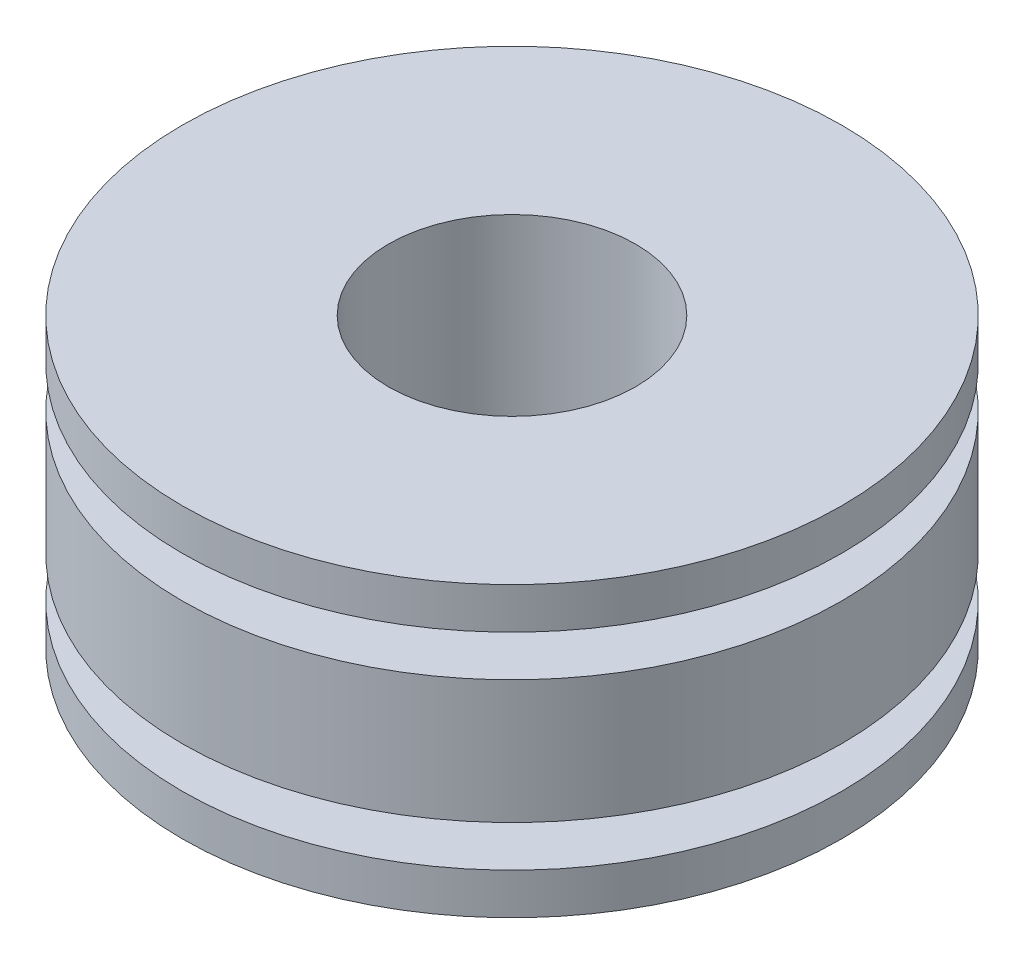
ISO-10303-21;
HEADER;
FILE_DESCRIPTION(('STEP AP214'),'2;1');
FILE_NAME('part.step','',(''),(''),'','','');
FILE_SCHEMA(('AUTOMOTIVE_DESIGN { 1 0 10303 214 1 1 1 1 }'));
ENDSEC;
DATA;
#1=APPLICATION_CONTEXT('core data for automotive mechanical design processes');
#2=APPLICATION_PROTOCOL_DEFINITION('international standard','automotive_design',2000,#1);
#3=PRODUCT_CONTEXT('',#1,'mechanical');
#4=PRODUCT('Part','Part','',(#3));
#5=PRODUCT_RELATED_PRODUCT_CATEGORY('part','',(#4));
#6=PRODUCT_DEFINITION_FORMATION('','',#4);
#7=PRODUCT_DEFINITION_CONTEXT('part definition',#1,'design');
#8=PRODUCT_DEFINITION('design','',#6,#7);
#9=PRODUCT_DEFINITION_SHAPE('','',#8);
#10=(LENGTH_UNIT() NAMED_UNIT(*) SI_UNIT(.MILLI.,.METRE.));
#11=(NAMED_UNIT(*) PLANE_ANGLE_UNIT() SI_UNIT($,.RADIAN.));
#12=(NAMED_UNIT(*) SI_UNIT($,.STERADIAN.) SOLID_ANGLE_UNIT());
#13=UNCERTAINTY_MEASURE_WITH_UNIT(LENGTH_MEASURE(1.E-05),#10,'distance_accuracy_value','');
#14=(GEOMETRIC_REPRESENTATION_CONTEXT(3) GLOBAL_UNCERTAINTY_ASSIGNED_CONTEXT((#13)) GLOBAL_UNIT_ASSIGNED_CONTEXT((#10,
#11,#12)) REPRESENTATION_CONTEXT('',''));
#15=CARTESIAN_POINT('',(0.,0.,0.));
#16=DIRECTION('',(0.,0.,1.));
#17=DIRECTION('',(1.,0.,0.));
#18=AXIS2_PLACEMENT_3D('',#15,#16,#17);
#19=CARTESIAN_POINT('',(0.,0.,0.));
#20=DIRECTION('',(0.,-1.,0.));
#21=DIRECTION('',(0.,0.,-1.));
#22=AXIS2_PLACEMENT_3D('',#19,#20,#21);
#23=CYLINDRICAL_SURFACE('',#22,1.5);
#24=CARTESIAN_POINT('',(0.,0.,0.));
#25=DIRECTION('',(0.,-1.,0.));
#26=DIRECTION('',(0.,0.,-1.));
#27=AXIS2_PLACEMENT_3D('',#24,#25,#26);
#28=CIRCLE('',#27,1.5);
#29=CARTESIAN_POINT('',(0.,0.,-1.5));
#30=VERTEX_POINT('',#29);
#31=EDGE_CURVE('E10',#30,#30,#28,.T.);
#32=ORIENTED_EDGE('',*,*,#31,.T.);
#33=EDGE_LOOP('',(#32));
#34=FACE_BOUND('',#33,.T.);
#35=CARTESIAN_POINT('',(0.,3.5,0.));
#36=DIRECTION('',(0.,-1.,0.));
#37=DIRECTION('',(0.,0.,-1.));
#38=AXIS2_PLACEMENT_3D('',#35,#36,#37);
#39=CIRCLE('',#38,1.5);
#40=CARTESIAN_POINT('',(0.,3.5,-1.5));
#41=VERTEX_POINT('',#40);
#42=EDGE_CURVE('E74',#41,#41,#39,.T.);
#43=ORIENTED_EDGE('',*,*,#42,.F.);
#44=EDGE_LOOP('',(#43));
#45=FACE_BOUND('',#44,.T.);
#46=ADVANCED_FACE('F34',(#34,#45),#23,.F.);
#47=CARTESIAN_POINT('',(0.,0.,0.));
#48=DIRECTION('',(0.,1.,0.));
#49=DIRECTION('',(0.,0.,1.));
#50=AXIS2_PLACEMENT_3D('',#47,#48,#49);
#51=PLANE('',#50);
#52=ORIENTED_EDGE('',*,*,#31,.F.);
#53=EDGE_LOOP('',(#52));
#54=FACE_BOUND('',#53,.T.);
#55=CARTESIAN_POINT('',(0.,0.,0.));
#56=DIRECTION('',(0.,-1.,0.));
#57=DIRECTION('',(0.,0.,-1.));
#58=AXIS2_PLACEMENT_3D('',#55,#56,#57);
#59=CIRCLE('',#58,4.);
#60=CARTESIAN_POINT('',(0.,0.,-4.));
#61=VERTEX_POINT('',#60);
#62=EDGE_CURVE('E40',#61,#61,#59,.T.);
#63=ORIENTED_EDGE('',*,*,#62,.T.);
#64=EDGE_LOOP('',(#63));
#65=FACE_BOUND('',#64,.T.);
#66=ADVANCED_FACE('F81',(#54,#65),#51,.F.);
#67=CARTESIAN_POINT('',(0.,0.,0.));
#68=DIRECTION('',(0.,-1.,0.));
#69=DIRECTION('',(0.,0.,-1.));
#70=AXIS2_PLACEMENT_3D('',#67,#68,#69);
#71=CYLINDRICAL_SURFACE('',#70,4.);
#72=ORIENTED_EDGE('',*,*,#62,.F.);
#73=EDGE_LOOP('',(#72));
#74=FACE_BOUND('',#73,.T.);
#75=CARTESIAN_POINT('',(0.,0.5,0.));
#76=DIRECTION('',(0.,-1.,0.));
#77=DIRECTION('',(0.,0.,-1.));
#78=AXIS2_PLACEMENT_3D('',#75,#76,#77);
#79=CIRCLE('',#78,4.);
#80=CARTESIAN_POINT('',(0.,0.5,-4.));
#81=VERTEX_POINT('',#80);
#82=EDGE_CURVE('E44',#81,#81,#79,.T.);
#83=ORIENTED_EDGE('',*,*,#82,.T.);
#84=EDGE_LOOP('',(#83));
#85=FACE_BOUND('',#84,.T.);
#86=ADVANCED_FACE('F85',(#74,#85),#71,.T.);
#87=CARTESIAN_POINT('',(0.,0.5,0.));
#88=DIRECTION('',(0.,-1.,0.));
#89=DIRECTION('',(0.,0.,-1.));
#90=AXIS2_PLACEMENT_3D('',#87,#88,#89);
#91=PLANE('',#90);
#92=ORIENTED_EDGE('',*,*,#82,.F.);
#93=EDGE_LOOP('',(#92));
#94=FACE_BOUND('',#93,.T.);
#95=CARTESIAN_POINT('',(0.,0.5,0.));
#96=DIRECTION('',(0.,-1.,0.));
#97=DIRECTION('',(0.,0.,-1.));
#98=AXIS2_PLACEMENT_3D('',#95,#96,#97);
#99=CIRCLE('',#98,3.);
#100=CARTESIAN_POINT('',(0.,0.5,-3.));
#101=VERTEX_POINT('',#100);
#102=EDGE_CURVE('E48',#101,#101,#99,.T.);
#103=ORIENTED_EDGE('',*,*,#102,.T.);
#104=EDGE_LOOP('',(#103));
#105=FACE_BOUND('',#104,.T.);
#106=ADVANCED_FACE('F90',(#94,#105),#91,.F.);
#107=CARTESIAN_POINT('',(0.,0.,0.));
#108=DIRECTION('',(0.,-1.,0.));
#109=DIRECTION('',(0.,0.,-1.));
#110=AXIS2_PLACEMENT_3D('',#107,#108,#109);
#111=CYLINDRICAL_SURFACE('',#110,3.);
#112=ORIENTED_EDGE('',*,*,#102,.F.);
#113=EDGE_LOOP('',(#112));
#114=FACE_BOUND('',#113,.T.);
#115=CARTESIAN_POINT('',(0.,1.,0.));
#116=DIRECTION('',(0.,-1.,0.));
#117=DIRECTION('',(0.,0.,-1.));
#118=AXIS2_PLACEMENT_3D('',#115,#116,#117);
#119=CIRCLE('',#118,3.);
#120=CARTESIAN_POINT('',(0.,1.,-3.));
#121=VERTEX_POINT('',#120);
#122=EDGE_CURVE('E53',#121,#121,#119,.T.);
#123=ORIENTED_EDGE('',*,*,#122,.T.);
#124=EDGE_LOOP('',(#123));
#125=FACE_BOUND('',#124,.T.);
#126=ADVANCED_FACE('F96',(#114,#125),#111,.T.);
#127=CARTESIAN_POINT('',(0.,0.999999999999999,0.));
#128=DIRECTION('',(0.,1.,0.));
#129=DIRECTION('',(0.,0.,1.));
#130=AXIS2_PLACEMENT_3D('',#127,#128,#129);
#131=PLANE('',#130);
#132=ORIENTED_EDGE('',*,*,#122,.F.);
#133=EDGE_LOOP('',(#132));
#134=FACE_BOUND('',#133,.T.);
#135=CARTESIAN_POINT('',(0.,0.999999999999999,0.));
#136=DIRECTION('',(0.,-1.,0.));
#137=DIRECTION('',(0.,0.,-1.));
#138=AXIS2_PLACEMENT_3D('',#135,#136,#137);
#139=CIRCLE('',#138,4.);
#140=CARTESIAN_POINT('',(0.,0.999999999999999,-4.));
#141=VERTEX_POINT('',#140);
#142=EDGE_CURVE('E56',#141,#141,#139,.T.);
#143=ORIENTED_EDGE('',*,*,#142,.T.);
#144=EDGE_LOOP('',(#143));
#145=FACE_BOUND('',#144,.T.);
#146=ADVANCED_FACE('F100',(#134,#145),#131,.F.);
#147=CARTESIAN_POINT('',(0.,0.,0.));
#148=DIRECTION('',(0.,-1.,0.));
#149=DIRECTION('',(0.,0.,-1.));
#150=AXIS2_PLACEMENT_3D('',#147,#148,#149);
#151=CYLINDRICAL_SURFACE('',#150,4.);
#152=ORIENTED_EDGE('',*,*,#142,.F.);
#153=EDGE_LOOP('',(#152));
#154=FACE_BOUND('',#153,.T.);
#155=CARTESIAN_POINT('',(0.,2.5,0.));
#156=DIRECTION('',(0.,-1.,0.));
#157=DIRECTION('',(0.,0.,-1.));
#158=AXIS2_PLACEMENT_3D('',#155,#156,#157);
#159=CIRCLE('',#158,4.);
#160=CARTESIAN_POINT('',(0.,2.5,-4.));
#161=VERTEX_POINT('',#160);
#162=EDGE_CURVE('E59',#161,#161,#159,.T.);
#163=ORIENTED_EDGE('',*,*,#162,.T.);
#164=EDGE_LOOP('',(#163));
#165=FACE_BOUND('',#164,.T.);
#166=ADVANCED_FACE('F104',(#154,#165),#151,.T.);
#167=CARTESIAN_POINT('',(0.,2.5,0.));
#168=DIRECTION('',(0.,-1.,0.));
#169=DIRECTION('',(0.,0.,-1.));
#170=AXIS2_PLACEMENT_3D('',#167,#168,#169);
#171=PLANE('',#170);
#172=ORIENTED_EDGE('',*,*,#162,.F.);
#173=EDGE_LOOP('',(#172));
#174=FACE_BOUND('',#173,.T.);
#175=CARTESIAN_POINT('',(0.,2.5,0.));
#176=DIRECTION('',(0.,-1.,0.));
#177=DIRECTION('',(0.,0.,-1.));
#178=AXIS2_PLACEMENT_3D('',#175,#176,#177);
#179=CIRCLE('',#178,3.);
#180=CARTESIAN_POINT('',(0.,2.5,-3.));
#181=VERTEX_POINT('',#180);
#182=EDGE_CURVE('E62',#181,#181,#179,.T.);
#183=ORIENTED_EDGE('',*,*,#182,.T.);
#184=EDGE_LOOP('',(#183));
#185=FACE_BOUND('',#184,.T.);
#186=ADVANCED_FACE('F108',(#174,#185),#171,.F.);
#187=CARTESIAN_POINT('',(0.,0.,0.));
#188=DIRECTION('',(0.,-1.,0.));
#189=DIRECTION('',(0.,0.,-1.));
#190=AXIS2_PLACEMENT_3D('',#187,#188,#189);
#191=CYLINDRICAL_SURFACE('',#190,3.);
#192=ORIENTED_EDGE('',*,*,#182,.F.);
#193=EDGE_LOOP('',(#192));
#194=FACE_BOUND('',#193,.T.);
#195=CARTESIAN_POINT('',(0.,3.,0.));
#196=DIRECTION('',(0.,-1.,0.));
#197=DIRECTION('',(0.,0.,-1.));
#198=AXIS2_PLACEMENT_3D('',#195,#196,#197);
#199=CIRCLE('',#198,3.);
#200=CARTESIAN_POINT('',(0.,3.,-3.));
#201=VERTEX_POINT('',#200);
#202=EDGE_CURVE('E65',#201,#201,#199,.T.);
#203=ORIENTED_EDGE('',*,*,#202,.T.);
#204=EDGE_LOOP('',(#203));
#205=FACE_BOUND('',#204,.T.);
#206=ADVANCED_FACE('F112',(#194,#205),#191,.T.);
#207=CARTESIAN_POINT('',(0.,3.,0.));
#208=DIRECTION('',(0.,1.,0.));
#209=DIRECTION('',(0.,0.,1.));
#210=AXIS2_PLACEMENT_3D('',#207,#208,#209);
#211=PLANE('',#210);
#212=ORIENTED_EDGE('',*,*,#202,.F.);
#213=EDGE_LOOP('',(#212));
#214=FACE_BOUND('',#213,.T.);
#215=CARTESIAN_POINT('',(0.,3.,0.));
#216=DIRECTION('',(0.,-1.,0.));
#217=DIRECTION('',(0.,0.,-1.));
#218=AXIS2_PLACEMENT_3D('',#215,#216,#217);
#219=CIRCLE('',#218,4.);
#220=CARTESIAN_POINT('',(0.,3.,-4.));
#221=VERTEX_POINT('',#220);
#222=EDGE_CURVE('E68',#221,#221,#219,.T.);
#223=ORIENTED_EDGE('',*,*,#222,.T.);
#224=EDGE_LOOP('',(#223));
#225=FACE_BOUND('',#224,.T.);
#226=ADVANCED_FACE('F116',(#214,#225),#211,.F.);
#227=CARTESIAN_POINT('',(0.,0.,0.));
#228=DIRECTION('',(0.,-1.,0.));
#229=DIRECTION('',(0.,0.,-1.));
#230=AXIS2_PLACEMENT_3D('',#227,#228,#229);
#231=CYLINDRICAL_SURFACE('',#230,4.);
#232=ORIENTED_EDGE('',*,*,#222,.F.);
#233=EDGE_LOOP('',(#232));
#234=FACE_BOUND('',#233,.T.);
#235=CARTESIAN_POINT('',(0.,3.5,0.));
#236=DIRECTION('',(0.,-1.,0.));
#237=DIRECTION('',(0.,0.,-1.));
#238=AXIS2_PLACEMENT_3D('',#235,#236,#237);
#239=CIRCLE('',#238,4.);
#240=CARTESIAN_POINT('',(0.,3.5,-4.));
#241=VERTEX_POINT('',#240);
#242=EDGE_CURVE('E71',#241,#241,#239,.T.);
#243=ORIENTED_EDGE('',*,*,#242,.T.);
#244=EDGE_LOOP('',(#243));
#245=FACE_BOUND('',#244,.T.);
#246=ADVANCED_FACE('F120',(#234,#245),#231,.T.);
#247=CARTESIAN_POINT('',(0.,3.5,0.));
#248=DIRECTION('',(0.,-1.,0.));
#249=DIRECTION('',(0.,0.,-1.));
#250=AXIS2_PLACEMENT_3D('',#247,#248,#249);
#251=PLANE('',#250);
#252=ORIENTED_EDGE('',*,*,#242,.F.);
#253=EDGE_LOOP('',(#252));
#254=FACE_BOUND('',#253,.T.);
#255=ORIENTED_EDGE('',*,*,#42,.T.);
#256=EDGE_LOOP('',(#255));
#257=FACE_BOUND('',#256,.T.);
#258=ADVANCED_FACE('F78',(#254,#257),#251,.F.);
#259=CLOSED_SHELL('',(#46,#66,#86,#106,#126,#146,#166,#186,#206,#226,#246,#258));
#260=MANIFOLD_SOLID_BREP('B2',#259);
#261=ADVANCED_BREP_SHAPE_REPRESENTATION('',(#18,#260),#14);
#262=SHAPE_DEFINITION_REPRESENTATION(#9,#261);
ENDSEC;
END-ISO-10303-21;
